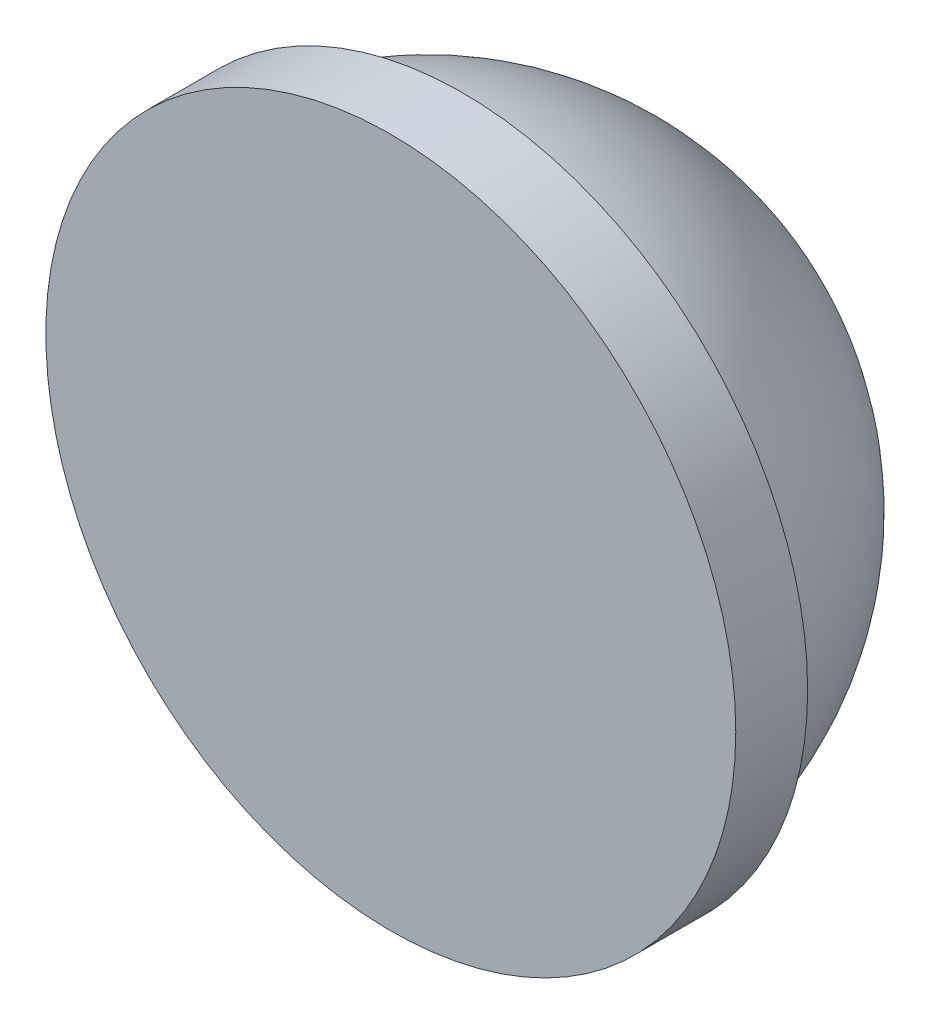
ISO-10303-21;
HEADER;
FILE_DESCRIPTION(('STEP AP214'),'2;1');
FILE_NAME('part.step','',(''),(''),'','','');
FILE_SCHEMA(('AUTOMOTIVE_DESIGN { 1 0 10303 214 1 1 1 1 }'));
ENDSEC;
DATA;
#1=APPLICATION_CONTEXT('core data for automotive mechanical design processes');
#2=APPLICATION_PROTOCOL_DEFINITION('international standard','automotive_design',2000,#1);
#3=PRODUCT_CONTEXT('',#1,'mechanical');
#4=PRODUCT('Part','Part','',(#3));
#5=PRODUCT_RELATED_PRODUCT_CATEGORY('part','',(#4));
#6=PRODUCT_DEFINITION_FORMATION('','',#4);
#7=PRODUCT_DEFINITION_CONTEXT('part definition',#1,'design');
#8=PRODUCT_DEFINITION('design','',#6,#7);
#9=PRODUCT_DEFINITION_SHAPE('','',#8);
#10=(LENGTH_UNIT() NAMED_UNIT(*) SI_UNIT(.MILLI.,.METRE.));
#11=(NAMED_UNIT(*) PLANE_ANGLE_UNIT() SI_UNIT($,.RADIAN.));
#12=(NAMED_UNIT(*) SI_UNIT($,.STERADIAN.) SOLID_ANGLE_UNIT());
#13=UNCERTAINTY_MEASURE_WITH_UNIT(LENGTH_MEASURE(1.E-05),#10,'distance_accuracy_value','');
#14=(GEOMETRIC_REPRESENTATION_CONTEXT(3) GLOBAL_UNCERTAINTY_ASSIGNED_CONTEXT((#13)) GLOBAL_UNIT_ASSIGNED_CONTEXT((#10,
#11,#12)) REPRESENTATION_CONTEXT('',''));
#15=CARTESIAN_POINT('',(0.,0.,0.));
#16=DIRECTION('',(0.,0.,1.));
#17=DIRECTION('',(1.,0.,0.));
#18=AXIS2_PLACEMENT_3D('',#15,#16,#17);
#19=CARTESIAN_POINT('',(0.,0.,0.5));
#20=DIRECTION('',(0.,0.,-1.));
#21=DIRECTION('',(-1.,0.,0.));
#22=AXIS2_PLACEMENT_3D('',#19,#20,#21);
#23=PLANE('',#22);
#24=CARTESIAN_POINT('',(0.,0.,0.5));
#25=DIRECTION('',(0.,0.,1.));
#26=DIRECTION('',(1.,0.,0.));
#27=AXIS2_PLACEMENT_3D('',#24,#25,#26);
#28=CIRCLE('',#27,4.8);
#29=CARTESIAN_POINT('',(4.8,0.,0.5));
#30=VERTEX_POINT('',#29);
#31=EDGE_CURVE('E40',#30,#30,#28,.T.);
#32=ORIENTED_EDGE('',*,*,#31,.T.);
#33=EDGE_LOOP('',(#32));
#34=FACE_BOUND('',#33,.T.);
#35=ADVANCED_FACE('F30',(#34),#23,.F.);
#36=CARTESIAN_POINT('',(0.,0.,0.));
#37=DIRECTION('',(0.,0.,1.));
#38=DIRECTION('',(0.,1.,0.));
#39=AXIS2_PLACEMENT_3D('',#36,#37,#38);
#40=SPHERICAL_SURFACE('',#39,4.5);
#41=CARTESIAN_POINT('',(0.,0.,-0.5));
#42=DIRECTION('',(0.,0.,1.));
#43=DIRECTION('',(1.,0.,0.));
#44=AXIS2_PLACEMENT_3D('',#41,#42,#43);
#45=CIRCLE('',#44,4.47213595499958);
#46=CARTESIAN_POINT('',(4.47213595499958,0.,-0.5));
#47=VERTEX_POINT('',#46);
#48=EDGE_CURVE('E10',#47,#47,#45,.T.);
#49=ORIENTED_EDGE('',*,*,#48,.F.);
#50=EDGE_LOOP('',(#49));
#51=FACE_BOUND('',#50,.T.);
#52=ADVANCED_FACE('F55',(#51),#40,.T.);
#53=CARTESIAN_POINT('',(0.,4.47213595499958,-0.5));
#54=DIRECTION('',(0.,0.,1.));
#55=DIRECTION('',(1.,0.,0.));
#56=AXIS2_PLACEMENT_3D('',#53,#54,#55);
#57=PLANE('',#56);
#58=CARTESIAN_POINT('',(0.,0.,-0.5));
#59=DIRECTION('',(0.,0.,1.));
#60=DIRECTION('',(1.,0.,0.));
#61=AXIS2_PLACEMENT_3D('',#58,#59,#60);
#62=CIRCLE('',#61,4.8);
#63=CARTESIAN_POINT('',(4.8,0.,-0.5));
#64=VERTEX_POINT('',#63);
#65=EDGE_CURVE('E36',#64,#64,#62,.T.);
#66=ORIENTED_EDGE('',*,*,#65,.F.);
#67=EDGE_LOOP('',(#66));
#68=FACE_BOUND('',#67,.T.);
#69=ORIENTED_EDGE('',*,*,#48,.T.);
#70=EDGE_LOOP('',(#69));
#71=FACE_BOUND('',#70,.T.);
#72=ADVANCED_FACE('F50',(#68,#71),#57,.F.);
#73=CARTESIAN_POINT('',(0.,0.,0.5));
#74=DIRECTION('',(0.,0.,1.));
#75=DIRECTION('',(1.,0.,0.));
#76=AXIS2_PLACEMENT_3D('',#73,#74,#75);
#77=CYLINDRICAL_SURFACE('',#76,4.8);
#78=ORIENTED_EDGE('',*,*,#31,.F.);
#79=EDGE_LOOP('',(#78));
#80=FACE_BOUND('',#79,.T.);
#81=ORIENTED_EDGE('',*,*,#65,.T.);
#82=EDGE_LOOP('',(#81));
#83=FACE_BOUND('',#82,.T.);
#84=ADVANCED_FACE('F48',(#80,#83),#77,.T.);
#85=CLOSED_SHELL('',(#35,#52,#72,#84));
#86=MANIFOLD_SOLID_BREP('B2',#85);
#87=ADVANCED_BREP_SHAPE_REPRESENTATION('',(#18,#86),#14);
#88=SHAPE_DEFINITION_REPRESENTATION(#9,#87);
ENDSEC;
END-ISO-10303-21;
